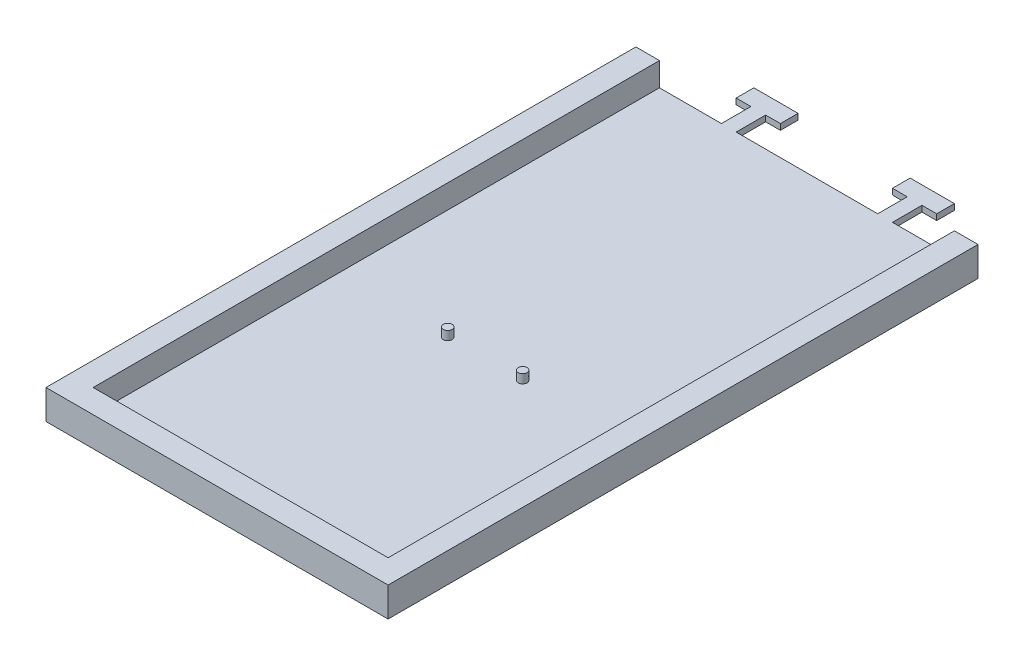
ISO-10303-21;
HEADER;
FILE_DESCRIPTION(('STEP AP214'),'2;1');
FILE_NAME('part.step','',(''),(''),'','','');
FILE_SCHEMA(('AUTOMOTIVE_DESIGN { 1 0 10303 214 1 1 1 1 }'));
ENDSEC;
DATA;
#1=APPLICATION_CONTEXT('core data for automotive mechanical design processes');
#2=APPLICATION_PROTOCOL_DEFINITION('international standard','automotive_design',2000,#1);
#3=PRODUCT_CONTEXT('',#1,'mechanical');
#4=PRODUCT('Part','Part','',(#3));
#5=PRODUCT_RELATED_PRODUCT_CATEGORY('part','',(#4));
#6=PRODUCT_DEFINITION_FORMATION('','',#4);
#7=PRODUCT_DEFINITION_CONTEXT('part definition',#1,'design');
#8=PRODUCT_DEFINITION('design','',#6,#7);
#9=PRODUCT_DEFINITION_SHAPE('','',#8);
#10=(LENGTH_UNIT() NAMED_UNIT(*) SI_UNIT(.MILLI.,.METRE.));
#11=(NAMED_UNIT(*) PLANE_ANGLE_UNIT() SI_UNIT($,.RADIAN.));
#12=(NAMED_UNIT(*) SI_UNIT($,.STERADIAN.) SOLID_ANGLE_UNIT());
#13=UNCERTAINTY_MEASURE_WITH_UNIT(LENGTH_MEASURE(1.E-05),#10,'distance_accuracy_value','');
#14=(GEOMETRIC_REPRESENTATION_CONTEXT(3) GLOBAL_UNCERTAINTY_ASSIGNED_CONTEXT((#13)) GLOBAL_UNIT_ASSIGNED_CONTEXT((#10,
#11,#12)) REPRESENTATION_CONTEXT('',''));
#15=CARTESIAN_POINT('',(0.,0.,0.));
#16=DIRECTION('',(0.,0.,1.));
#17=DIRECTION('',(1.,0.,0.));
#18=AXIS2_PLACEMENT_3D('',#15,#16,#17);
#19=CARTESIAN_POINT('',(-1156.10486715688,10.,-361.26737968449));
#20=DIRECTION('',(1.,0.,0.));
#21=DIRECTION('',(0.,0.,-1.));
#22=AXIS2_PLACEMENT_3D('',#19,#20,#21);
#23=PLANE('',#22);
#24=DIRECTION('',(0.,0.,1.));
#25=VECTOR('',#24,1.);
#26=CARTESIAN_POINT('',(-1156.10486715688,10.,-361.26737968449));
#27=LINE('',#26,#25);
#28=CARTESIAN_POINT('',(-1156.10486715688,10.,-561.26737968449));
#29=VERTEX_POINT('',#28);
#30=CARTESIAN_POINT('',(-1156.10486715688,10.,-361.26737968449));
#31=VERTEX_POINT('',#30);
#32=EDGE_CURVE('E100',#29,#31,#27,.T.);
#33=ORIENTED_EDGE('',*,*,#32,.F.);
#34=DIRECTION('',(0.,1.,0.));
#35=VECTOR('',#34,1.);
#36=CARTESIAN_POINT('',(-1156.10486715688,-8.,-561.26737968449));
#37=LINE('',#36,#35);
#38=CARTESIAN_POINT('',(-1156.10486715688,0.,-561.26737968449));
#39=VERTEX_POINT('',#38);
#40=EDGE_CURVE('E171',#39,#29,#37,.T.);
#41=ORIENTED_EDGE('',*,*,#40,.F.);
#42=DIRECTION('',(0.,0.,1.));
#43=VECTOR('',#42,1.);
#44=CARTESIAN_POINT('',(-1156.10486715688,0.,-361.26737968449));
#45=LINE('',#44,#43);
#46=CARTESIAN_POINT('',(-1156.10486715688,0.,-361.26737968449));
#47=VERTEX_POINT('',#46);
#48=EDGE_CURVE('E85',#39,#47,#45,.T.);
#49=ORIENTED_EDGE('',*,*,#48,.T.);
#50=DIRECTION('',(0.,-1.,0.));
#51=VECTOR('',#50,1.);
#52=CARTESIAN_POINT('',(-1156.10486715688,10.,-361.26737968449));
#53=LINE('',#52,#51);
#54=EDGE_CURVE('E80',#31,#47,#53,.T.);
#55=ORIENTED_EDGE('',*,*,#54,.F.);
#56=EDGE_LOOP('',(#33,#41,#49,#55));
#57=FACE_BOUND('',#56,.T.);
#58=ADVANCED_FACE('F38',(#57),#23,.F.);
#59=CARTESIAN_POINT('',(0.,0.,0.));
#60=DIRECTION('',(0.,-1.,0.));
#61=DIRECTION('',(0.,0.,-1.));
#62=AXIS2_PLACEMENT_3D('',#59,#60,#61);
#63=PLANE('',#62);
#64=DIRECTION('',(-1.,0.,0.));
#65=VECTOR('',#64,1.);
#66=CARTESIAN_POINT('',(0.,0.,-561.26737968449));
#67=LINE('',#66,#65);
#68=CARTESIAN_POINT('',(-1040.10486715688,0.,-561.26737968449));
#69=VERTEX_POINT('',#68);
#70=CARTESIAN_POINT('',(-1069.10486715688,0.,-561.26737968449));
#71=VERTEX_POINT('',#70);
#72=EDGE_CURVE('E98',#69,#71,#67,.T.);
#73=ORIENTED_EDGE('',*,*,#72,.F.);
#74=DIRECTION('',(0.,0.,-1.));
#75=VECTOR('',#74,1.);
#76=CARTESIAN_POINT('',(-1040.10486715688,0.,-777.26737968449));
#77=LINE('',#76,#75);
#78=CARTESIAN_POINT('',(-1040.10486715688,0.,-361.26737968449));
#79=VERTEX_POINT('',#78);
#80=EDGE_CURVE('E84',#79,#69,#77,.T.);
#81=ORIENTED_EDGE('',*,*,#80,.F.);
#82=DIRECTION('',(1.,0.,0.));
#83=VECTOR('',#82,1.);
#84=CARTESIAN_POINT('',(-1040.10486715688,0.,-361.26737968449));
#85=LINE('',#84,#83);
#86=EDGE_CURVE('E74',#47,#79,#85,.T.);
#87=ORIENTED_EDGE('',*,*,#86,.F.);
#88=ORIENTED_EDGE('',*,*,#48,.F.);
#89=DIRECTION('',(1.,0.,0.));
#90=VECTOR('',#89,1.);
#91=CARTESIAN_POINT('',(0.,0.,-561.26737968449));
#92=LINE('',#91,#90);
#93=CARTESIAN_POINT('',(-1127.10486715688,0.,-561.26737968449));
#94=VERTEX_POINT('',#93);
#95=EDGE_CURVE('E45',#39,#94,#92,.T.);
#96=ORIENTED_EDGE('',*,*,#95,.T.);
#97=DIRECTION('',(0.,0.,1.));
#98=VECTOR('',#97,1.);
#99=CARTESIAN_POINT('',(-1127.10486715688,0.,0.));
#100=LINE('',#99,#98);
#101=CARTESIAN_POINT('',(-1127.10486715688,0.,-571.26737968449));
#102=VERTEX_POINT('',#101);
#103=EDGE_CURVE('E141',#102,#94,#100,.T.);
#104=ORIENTED_EDGE('',*,*,#103,.F.);
#105=DIRECTION('',(1.,0.,0.));
#106=VECTOR('',#105,1.);
#107=CARTESIAN_POINT('',(0.,0.,-571.26737968449));
#108=LINE('',#107,#106);
#109=CARTESIAN_POINT('',(-1132.10486715688,0.,-571.26737968449));
#110=VERTEX_POINT('',#109);
#111=EDGE_CURVE('E138',#110,#102,#108,.T.);
#112=ORIENTED_EDGE('',*,*,#111,.F.);
#113=DIRECTION('',(0.,0.,1.));
#114=VECTOR('',#113,1.);
#115=CARTESIAN_POINT('',(-1132.10486715688,0.,0.));
#116=LINE('',#115,#114);
#117=CARTESIAN_POINT('',(-1132.10486715688,0.,-577.26737968449));
#118=VERTEX_POINT('',#117);
#119=EDGE_CURVE('E249',#118,#110,#116,.T.);
#120=ORIENTED_EDGE('',*,*,#119,.F.);
#121=DIRECTION('',(1.,0.,0.));
#122=VECTOR('',#121,1.);
#123=CARTESIAN_POINT('',(0.,0.,-577.26737968449));
#124=LINE('',#123,#122);
#125=CARTESIAN_POINT('',(-1117.10486715688,0.,-577.26737968449));
#126=VERTEX_POINT('',#125);
#127=EDGE_CURVE('E259',#118,#126,#124,.T.);
#128=ORIENTED_EDGE('',*,*,#127,.T.);
#129=DIRECTION('',(0.,0.,1.));
#130=VECTOR('',#129,1.);
#131=CARTESIAN_POINT('',(-1117.10486715688,0.,0.));
#132=LINE('',#131,#130);
#133=CARTESIAN_POINT('',(-1117.10486715688,0.,-571.26737968449));
#134=VERTEX_POINT('',#133);
#135=EDGE_CURVE('E246',#126,#134,#132,.T.);
#136=ORIENTED_EDGE('',*,*,#135,.T.);
#137=DIRECTION('',(-1.,0.,0.));
#138=VECTOR('',#137,1.);
#139=CARTESIAN_POINT('',(0.,0.,-571.26737968449));
#140=LINE('',#139,#138);
#141=CARTESIAN_POINT('',(-1122.10486715688,0.,-571.26737968449));
#142=VERTEX_POINT('',#141);
#143=EDGE_CURVE('E135',#134,#142,#140,.T.);
#144=ORIENTED_EDGE('',*,*,#143,.T.);
#145=DIRECTION('',(0.,0.,1.));
#146=VECTOR('',#145,1.);
#147=CARTESIAN_POINT('',(-1122.10486715688,0.,0.));
#148=LINE('',#147,#146);
#149=CARTESIAN_POINT('',(-1122.10486715688,0.,-561.26737968449));
#150=VERTEX_POINT('',#149);
#151=EDGE_CURVE('E132',#142,#150,#148,.T.);
#152=ORIENTED_EDGE('',*,*,#151,.T.);
#153=DIRECTION('',(-1.,0.,0.));
#154=VECTOR('',#153,1.);
#155=CARTESIAN_POINT('',(0.,0.,-561.26737968449));
#156=LINE('',#155,#154);
#157=CARTESIAN_POINT('',(-1074.10486715688,0.,-561.26737968449));
#158=VERTEX_POINT('',#157);
#159=EDGE_CURVE('E129',#158,#150,#156,.T.);
#160=ORIENTED_EDGE('',*,*,#159,.F.);
#161=DIRECTION('',(0.,0.,1.));
#162=VECTOR('',#161,1.);
#163=CARTESIAN_POINT('',(-1074.10486715688,0.,0.));
#164=LINE('',#163,#162);
#165=CARTESIAN_POINT('',(-1074.10486715688,0.,-571.26737968449));
#166=VERTEX_POINT('',#165);
#167=EDGE_CURVE('E123',#166,#158,#164,.T.);
#168=ORIENTED_EDGE('',*,*,#167,.F.);
#169=DIRECTION('',(1.,0.,0.));
#170=VECTOR('',#169,1.);
#171=CARTESIAN_POINT('',(0.,0.,-571.26737968449));
#172=LINE('',#171,#170);
#173=CARTESIAN_POINT('',(-1079.10486715688,0.,-571.26737968449));
#174=VERTEX_POINT('',#173);
#175=EDGE_CURVE('E126',#174,#166,#172,.T.);
#176=ORIENTED_EDGE('',*,*,#175,.F.);
#177=DIRECTION('',(0.,0.,1.));
#178=VECTOR('',#177,1.);
#179=CARTESIAN_POINT('',(-1079.10486715688,0.,0.));
#180=LINE('',#179,#178);
#181=CARTESIAN_POINT('',(-1079.10486715688,0.,-577.26737968449));
#182=VERTEX_POINT('',#181);
#183=EDGE_CURVE('E243',#182,#174,#180,.T.);
#184=ORIENTED_EDGE('',*,*,#183,.F.);
#185=CARTESIAN_POINT('',(-1064.10486715688,0.,-577.26737968449));
#186=VERTEX_POINT('',#185);
#187=EDGE_CURVE('E256',#182,#186,#124,.T.);
#188=ORIENTED_EDGE('',*,*,#187,.T.);
#189=DIRECTION('',(0.,0.,1.));
#190=VECTOR('',#189,1.);
#191=CARTESIAN_POINT('',(-1064.10486715688,0.,0.));
#192=LINE('',#191,#190);
#193=CARTESIAN_POINT('',(-1064.10486715688,0.,-571.26737968449));
#194=VERTEX_POINT('',#193);
#195=EDGE_CURVE('E173',#186,#194,#192,.T.);
#196=ORIENTED_EDGE('',*,*,#195,.T.);
#197=DIRECTION('',(-1.,0.,0.));
#198=VECTOR('',#197,1.);
#199=CARTESIAN_POINT('',(0.,0.,-571.26737968449));
#200=LINE('',#199,#198);
#201=CARTESIAN_POINT('',(-1069.10486715688,0.,-571.26737968449));
#202=VERTEX_POINT('',#201);
#203=EDGE_CURVE('E120',#194,#202,#200,.T.);
#204=ORIENTED_EDGE('',*,*,#203,.T.);
#205=DIRECTION('',(0.,0.,1.));
#206=VECTOR('',#205,1.);
#207=CARTESIAN_POINT('',(-1069.10486715688,0.,0.));
#208=LINE('',#207,#206);
#209=EDGE_CURVE('E118',#202,#71,#208,.T.);
#210=ORIENTED_EDGE('',*,*,#209,.T.);
#211=EDGE_LOOP('',(#73,#81,#87,#88,#96,#104,#112,#120,#128,#136,#144,#152,#160,#168,#176,#184,
#188,#196,#204,#210));
#212=FACE_BOUND('',#211,.T.);
#213=ADVANCED_FACE('F95',(#212),#63,.T.);
#214=CARTESIAN_POINT('',(-1040.10486715688,10.,-777.26737968449));
#215=DIRECTION('',(-1.,0.,0.));
#216=DIRECTION('',(0.,0.,1.));
#217=AXIS2_PLACEMENT_3D('',#214,#215,#216);
#218=PLANE('',#217);
#219=DIRECTION('',(0.,1.,0.));
#220=VECTOR('',#219,1.);
#221=CARTESIAN_POINT('',(-1040.10486715688,0.,-561.26737968449));
#222=LINE('',#221,#220);
#223=CARTESIAN_POINT('',(-1040.10486715688,10.,-561.26737968449));
#224=VERTEX_POINT('',#223);
#225=EDGE_CURVE('E311',#69,#224,#222,.T.);
#226=ORIENTED_EDGE('',*,*,#225,.T.);
#227=DIRECTION('',(0.,0.,-1.));
#228=VECTOR('',#227,1.);
#229=CARTESIAN_POINT('',(-1040.10486715688,10.,-777.26737968449));
#230=LINE('',#229,#228);
#231=CARTESIAN_POINT('',(-1040.10486715688,10.,-361.26737968449));
#232=VERTEX_POINT('',#231);
#233=EDGE_CURVE('E92',#232,#224,#230,.T.);
#234=ORIENTED_EDGE('',*,*,#233,.F.);
#235=DIRECTION('',(0.,-1.,0.));
#236=VECTOR('',#235,1.);
#237=CARTESIAN_POINT('',(-1040.10486715688,10.,-361.26737968449));
#238=LINE('',#237,#236);
#239=EDGE_CURVE('E77',#232,#79,#238,.T.);
#240=ORIENTED_EDGE('',*,*,#239,.T.);
#241=ORIENTED_EDGE('',*,*,#80,.T.);
#242=EDGE_LOOP('',(#226,#234,#240,#241));
#243=FACE_BOUND('',#242,.T.);
#244=ADVANCED_FACE('F90',(#243),#218,.F.);
#245=CARTESIAN_POINT('',(0.,10.,0.));
#246=DIRECTION('',(0.,-1.,0.));
#247=DIRECTION('',(0.,0.,-1.));
#248=AXIS2_PLACEMENT_3D('',#245,#246,#247);
#249=PLANE('',#248);
#250=DIRECTION('',(-1.,0.,0.));
#251=VECTOR('',#250,1.);
#252=CARTESIAN_POINT('',(-1148.10486715688,10.,-561.26737968449));
#253=LINE('',#252,#251);
#254=CARTESIAN_POINT('',(-1148.10486715688,10.,-561.26737968449));
#255=VERTEX_POINT('',#254);
#256=EDGE_CURVE('E300',#255,#29,#253,.T.);
#257=ORIENTED_EDGE('',*,*,#256,.T.);
#258=ORIENTED_EDGE('',*,*,#32,.T.);
#259=DIRECTION('',(1.,0.,0.));
#260=VECTOR('',#259,1.);
#261=CARTESIAN_POINT('',(-1040.10486715688,10.,-361.26737968449));
#262=LINE('',#261,#260);
#263=EDGE_CURVE('E61',#31,#232,#262,.T.);
#264=ORIENTED_EDGE('',*,*,#263,.T.);
#265=ORIENTED_EDGE('',*,*,#233,.T.);
#266=DIRECTION('',(-1.,0.,0.));
#267=VECTOR('',#266,1.);
#268=CARTESIAN_POINT('',(-1040.10486715688,10.,-561.26737968449));
#269=LINE('',#268,#267);
#270=CARTESIAN_POINT('',(-1048.10486715688,10.,-561.26737968449));
#271=VERTEX_POINT('',#270);
#272=EDGE_CURVE('E307',#224,#271,#269,.T.);
#273=ORIENTED_EDGE('',*,*,#272,.T.);
#274=DIRECTION('',(0.,0.,-1.));
#275=VECTOR('',#274,1.);
#276=CARTESIAN_POINT('',(-1048.10486715688,10.,-769.26737968449));
#277=LINE('',#276,#275);
#278=CARTESIAN_POINT('',(-1048.10486715688,10.,-369.26737968449));
#279=VERTEX_POINT('',#278);
#280=EDGE_CURVE('E263',#279,#271,#277,.T.);
#281=ORIENTED_EDGE('',*,*,#280,.F.);
#282=DIRECTION('',(1.,0.,0.));
#283=VECTOR('',#282,1.);
#284=CARTESIAN_POINT('',(-1148.10486715688,10.,-369.26737968449));
#285=LINE('',#284,#283);
#286=CARTESIAN_POINT('',(-1148.10486715688,10.,-369.26737968449));
#287=VERTEX_POINT('',#286);
#288=EDGE_CURVE('E271',#287,#279,#285,.T.);
#289=ORIENTED_EDGE('',*,*,#288,.F.);
#290=DIRECTION('',(0.,0.,1.));
#291=VECTOR('',#290,1.);
#292=CARTESIAN_POINT('',(-1148.10486715688,10.,-769.26737968449));
#293=LINE('',#292,#291);
#294=EDGE_CURVE('E280',#255,#287,#293,.T.);
#295=ORIENTED_EDGE('',*,*,#294,.F.);
#296=EDGE_LOOP('',(#257,#258,#264,#265,#273,#281,#289,#295));
#297=FACE_BOUND('',#296,.T.);
#298=ADVANCED_FACE('F305',(#297),#249,.F.);
#299=CARTESIAN_POINT('',(-1048.10486715688,2.,-769.26737968449));
#300=DIRECTION('',(1.,0.,0.));
#301=DIRECTION('',(0.,0.,-1.));
#302=AXIS2_PLACEMENT_3D('',#299,#300,#301);
#303=PLANE('',#302);
#304=DIRECTION('',(0.,1.,0.));
#305=VECTOR('',#304,1.);
#306=CARTESIAN_POINT('',(-1048.10486715688,0.,-561.26737968449));
#307=LINE('',#306,#305);
#308=CARTESIAN_POINT('',(-1048.10486715688,2.,-561.26737968449));
#309=VERTEX_POINT('',#308);
#310=EDGE_CURVE('E316',#309,#271,#307,.T.);
#311=ORIENTED_EDGE('',*,*,#310,.F.);
#312=DIRECTION('',(0.,0.,-1.));
#313=VECTOR('',#312,1.);
#314=CARTESIAN_POINT('',(-1048.10486715688,2.,-769.26737968449));
#315=LINE('',#314,#313);
#316=CARTESIAN_POINT('',(-1048.10486715688,2.,-369.26737968449));
#317=VERTEX_POINT('',#316);
#318=EDGE_CURVE('E267',#317,#309,#315,.T.);
#319=ORIENTED_EDGE('',*,*,#318,.F.);
#320=DIRECTION('',(0.,1.,0.));
#321=VECTOR('',#320,1.);
#322=CARTESIAN_POINT('',(-1048.10486715688,2.,-369.26737968449));
#323=LINE('',#322,#321);
#324=EDGE_CURVE('E285',#317,#279,#323,.T.);
#325=ORIENTED_EDGE('',*,*,#324,.T.);
#326=ORIENTED_EDGE('',*,*,#280,.T.);
#327=EDGE_LOOP('',(#311,#319,#325,#326));
#328=FACE_BOUND('',#327,.T.);
#329=ADVANCED_FACE('F411',(#328),#303,.F.);
#330=CARTESIAN_POINT('',(-1148.10486715688,2.,-769.26737968449));
#331=DIRECTION('',(-1.,0.,0.));
#332=DIRECTION('',(0.,0.,1.));
#333=AXIS2_PLACEMENT_3D('',#330,#331,#332);
#334=PLANE('',#333);
#335=DIRECTION('',(0.,1.,0.));
#336=VECTOR('',#335,1.);
#337=CARTESIAN_POINT('',(-1148.10486715688,0.,-561.26737968449));
#338=LINE('',#337,#336);
#339=CARTESIAN_POINT('',(-1148.10486715688,2.,-561.26737968449));
#340=VERTEX_POINT('',#339);
#341=EDGE_CURVE('E224',#340,#255,#338,.T.);
#342=ORIENTED_EDGE('',*,*,#341,.T.);
#343=ORIENTED_EDGE('',*,*,#294,.T.);
#344=DIRECTION('',(0.,1.,0.));
#345=VECTOR('',#344,1.);
#346=CARTESIAN_POINT('',(-1148.10486715688,2.,-369.26737968449));
#347=LINE('',#346,#345);
#348=CARTESIAN_POINT('',(-1148.10486715688,2.,-369.26737968449));
#349=VERTEX_POINT('',#348);
#350=EDGE_CURVE('E277',#349,#287,#347,.T.);
#351=ORIENTED_EDGE('',*,*,#350,.F.);
#352=DIRECTION('',(0.,0.,1.));
#353=VECTOR('',#352,1.);
#354=CARTESIAN_POINT('',(-1148.10486715688,2.,-769.26737968449));
#355=LINE('',#354,#353);
#356=EDGE_CURVE('E270',#340,#349,#355,.T.);
#357=ORIENTED_EDGE('',*,*,#356,.F.);
#358=EDGE_LOOP('',(#342,#343,#351,#357));
#359=FACE_BOUND('',#358,.T.);
#360=ADVANCED_FACE('F429',(#359),#334,.F.);
#361=CARTESIAN_POINT('',(0.,2.,0.));
#362=DIRECTION('',(0.,1.,0.));
#363=DIRECTION('',(0.,0.,1.));
#364=AXIS2_PLACEMENT_3D('',#361,#362,#363);
#365=PLANE('',#364);
#366=CARTESIAN_POINT('',(-1110.80486715688,2.,-452.168271651608));
#367=DIRECTION('',(0.,1.,0.));
#368=DIRECTION('',(0.,0.,1.));
#369=AXIS2_PLACEMENT_3D('',#366,#367,#368);
#370=CIRCLE('',#369,1.50000000000008);
#371=CARTESIAN_POINT('',(-1110.80486715688,2.,-450.668271651608));
#372=VERTEX_POINT('',#371);
#373=EDGE_CURVE('E11',#372,#372,#370,.T.);
#374=ORIENTED_EDGE('',*,*,#373,.F.);
#375=EDGE_LOOP('',(#374));
#376=FACE_BOUND('',#375,.T.);
#377=CARTESIAN_POINT('',(-1085.40486715688,2.,-452.168271651608));
#378=DIRECTION('',(0.,1.,0.));
#379=DIRECTION('',(0.,0.,1.));
#380=AXIS2_PLACEMENT_3D('',#377,#378,#379);
#381=CIRCLE('',#380,1.50000000000008);
#382=CARTESIAN_POINT('',(-1085.40486715688,2.,-450.668271651608));
#383=VERTEX_POINT('',#382);
#384=EDGE_CURVE('E264',#383,#383,#381,.T.);
#385=ORIENTED_EDGE('',*,*,#384,.F.);
#386=EDGE_LOOP('',(#385));
#387=FACE_BOUND('',#386,.T.);
#388=DIRECTION('',(0.,0.,-1.));
#389=VECTOR('',#388,1.);
#390=CARTESIAN_POINT('',(-1127.10486715688,2.,0.));
#391=LINE('',#390,#389);
#392=CARTESIAN_POINT('',(-1127.10486715688,2.,-561.26737968449));
#393=VERTEX_POINT('',#392);
#394=CARTESIAN_POINT('',(-1127.10486715688,2.,-571.26737968449));
#395=VERTEX_POINT('',#394);
#396=EDGE_CURVE('E181',#393,#395,#391,.T.);
#397=ORIENTED_EDGE('',*,*,#396,.F.);
#398=DIRECTION('',(-1.,0.,0.));
#399=VECTOR('',#398,1.);
#400=CARTESIAN_POINT('',(0.,2.,-561.26737968449));
#401=LINE('',#400,#399);
#402=EDGE_CURVE('E169',#393,#340,#401,.T.);
#403=ORIENTED_EDGE('',*,*,#402,.T.);
#404=ORIENTED_EDGE('',*,*,#356,.T.);
#405=DIRECTION('',(1.,0.,0.));
#406=VECTOR('',#405,1.);
#407=CARTESIAN_POINT('',(-1148.10486715688,2.,-369.26737968449));
#408=LINE('',#407,#406);
#409=EDGE_CURVE('E274',#349,#317,#408,.T.);
#410=ORIENTED_EDGE('',*,*,#409,.T.);
#411=ORIENTED_EDGE('',*,*,#318,.T.);
#412=DIRECTION('',(1.,0.,0.));
#413=VECTOR('',#412,1.);
#414=CARTESIAN_POINT('',(0.,2.,-561.26737968449));
#415=LINE('',#414,#413);
#416=CARTESIAN_POINT('',(-1069.10486715688,2.,-561.26737968449));
#417=VERTEX_POINT('',#416);
#418=EDGE_CURVE('E223',#417,#309,#415,.T.);
#419=ORIENTED_EDGE('',*,*,#418,.F.);
#420=DIRECTION('',(0.,0.,-1.));
#421=VECTOR('',#420,1.);
#422=CARTESIAN_POINT('',(-1069.10486715688,2.,0.));
#423=LINE('',#422,#421);
#424=CARTESIAN_POINT('',(-1069.10486715688,2.,-571.26737968449));
#425=VERTEX_POINT('',#424);
#426=EDGE_CURVE('E220',#417,#425,#423,.T.);
#427=ORIENTED_EDGE('',*,*,#426,.T.);
#428=DIRECTION('',(1.,0.,0.));
#429=VECTOR('',#428,1.);
#430=CARTESIAN_POINT('',(0.,2.,-571.26737968449));
#431=LINE('',#430,#429);
#432=CARTESIAN_POINT('',(-1064.10486715688,2.,-571.26737968449));
#433=VERTEX_POINT('',#432);
#434=EDGE_CURVE('E230',#425,#433,#431,.T.);
#435=ORIENTED_EDGE('',*,*,#434,.T.);
#436=DIRECTION('',(0.,0.,-1.));
#437=VECTOR('',#436,1.);
#438=CARTESIAN_POINT('',(-1064.10486715688,2.,0.));
#439=LINE('',#438,#437);
#440=CARTESIAN_POINT('',(-1064.10486715688,2.,-577.26737968449));
#441=VERTEX_POINT('',#440);
#442=EDGE_CURVE('E227',#433,#441,#439,.T.);
#443=ORIENTED_EDGE('',*,*,#442,.T.);
#444=DIRECTION('',(-1.,0.,0.));
#445=VECTOR('',#444,1.);
#446=CARTESIAN_POINT('',(0.,2.,-577.26737968449));
#447=LINE('',#446,#445);
#448=CARTESIAN_POINT('',(-1079.10486715688,2.,-577.26737968449));
#449=VERTEX_POINT('',#448);
#450=EDGE_CURVE('E255',#441,#449,#447,.T.);
#451=ORIENTED_EDGE('',*,*,#450,.T.);
#452=DIRECTION('',(0.,0.,-1.));
#453=VECTOR('',#452,1.);
#454=CARTESIAN_POINT('',(-1079.10486715688,2.,0.));
#455=LINE('',#454,#453);
#456=CARTESIAN_POINT('',(-1079.10486715688,2.,-571.26737968449));
#457=VERTEX_POINT('',#456);
#458=EDGE_CURVE('E52',#457,#449,#455,.T.);
#459=ORIENTED_EDGE('',*,*,#458,.F.);
#460=DIRECTION('',(-1.,0.,0.));
#461=VECTOR('',#460,1.);
#462=CARTESIAN_POINT('',(0.,2.,-571.26737968449));
#463=LINE('',#462,#461);
#464=CARTESIAN_POINT('',(-1074.10486715688,2.,-571.26737968449));
#465=VERTEX_POINT('',#464);
#466=EDGE_CURVE('E189',#465,#457,#463,.T.);
#467=ORIENTED_EDGE('',*,*,#466,.F.);
#468=DIRECTION('',(0.,0.,-1.));
#469=VECTOR('',#468,1.);
#470=CARTESIAN_POINT('',(-1074.10486715688,2.,0.));
#471=LINE('',#470,#469);
#472=CARTESIAN_POINT('',(-1074.10486715688,2.,-561.26737968449));
#473=VERTEX_POINT('',#472);
#474=EDGE_CURVE('E185',#473,#465,#471,.T.);
#475=ORIENTED_EDGE('',*,*,#474,.F.);
#476=DIRECTION('',(1.,0.,0.));
#477=VECTOR('',#476,1.);
#478=CARTESIAN_POINT('',(0.,2.,-561.26737968449));
#479=LINE('',#478,#477);
#480=CARTESIAN_POINT('',(-1122.10486715688,2.,-561.26737968449));
#481=VERTEX_POINT('',#480);
#482=EDGE_CURVE('E182',#481,#473,#479,.T.);
#483=ORIENTED_EDGE('',*,*,#482,.F.);
#484=DIRECTION('',(0.,0.,-1.));
#485=VECTOR('',#484,1.);
#486=CARTESIAN_POINT('',(-1122.10486715688,2.,0.));
#487=LINE('',#486,#485);
#488=CARTESIAN_POINT('',(-1122.10486715688,2.,-571.26737968449));
#489=VERTEX_POINT('',#488);
#490=EDGE_CURVE('E199',#481,#489,#487,.T.);
#491=ORIENTED_EDGE('',*,*,#490,.T.);
#492=DIRECTION('',(1.,0.,0.));
#493=VECTOR('',#492,1.);
#494=CARTESIAN_POINT('',(0.,2.,-571.26737968449));
#495=LINE('',#494,#493);
#496=CARTESIAN_POINT('',(-1117.10486715688,2.,-571.26737968449));
#497=VERTEX_POINT('',#496);
#498=EDGE_CURVE('E196',#489,#497,#495,.T.);
#499=ORIENTED_EDGE('',*,*,#498,.T.);
#500=DIRECTION('',(0.,0.,-1.));
#501=VECTOR('',#500,1.);
#502=CARTESIAN_POINT('',(-1117.10486715688,2.,0.));
#503=LINE('',#502,#501);
#504=CARTESIAN_POINT('',(-1117.10486715688,2.,-577.26737968449));
#505=VERTEX_POINT('',#504);
#506=EDGE_CURVE('E193',#497,#505,#503,.T.);
#507=ORIENTED_EDGE('',*,*,#506,.T.);
#508=CARTESIAN_POINT('',(-1132.10486715688,2.,-577.26737968449));
#509=VERTEX_POINT('',#508);
#510=EDGE_CURVE('E252',#505,#509,#447,.T.);
#511=ORIENTED_EDGE('',*,*,#510,.T.);
#512=DIRECTION('',(0.,0.,-1.));
#513=VECTOR('',#512,1.);
#514=CARTESIAN_POINT('',(-1132.10486715688,2.,0.));
#515=LINE('',#514,#513);
#516=CARTESIAN_POINT('',(-1132.10486715688,2.,-571.26737968449));
#517=VERTEX_POINT('',#516);
#518=EDGE_CURVE('E322',#517,#509,#515,.T.);
#519=ORIENTED_EDGE('',*,*,#518,.F.);
#520=DIRECTION('',(-1.,0.,0.));
#521=VECTOR('',#520,1.);
#522=CARTESIAN_POINT('',(0.,2.,-571.26737968449));
#523=LINE('',#522,#521);
#524=EDGE_CURVE('E206',#395,#517,#523,.T.);
#525=ORIENTED_EDGE('',*,*,#524,.F.);
#526=EDGE_LOOP('',(#397,#403,#404,#410,#411,#419,#427,#435,#443,#451,#459,#467,#475,#483,#491,
#499,#507,#511,#519,#525));
#527=FACE_BOUND('',#526,.T.);
#528=ADVANCED_FACE('F331',(#376,#387,#527),#365,.T.);
#529=CARTESIAN_POINT('',(-1040.10486715688,12.,-577.26737968449));
#530=DIRECTION('',(0.,0.,-1.));
#531=DIRECTION('',(-1.,0.,0.));
#532=AXIS2_PLACEMENT_3D('',#529,#530,#531);
#533=PLANE('',#532);
#534=DIRECTION('',(0.,-1.,0.));
#535=VECTOR('',#534,1.);
#536=CARTESIAN_POINT('',(-1132.10486715688,12.,-577.26737968449));
#537=LINE('',#536,#535);
#538=EDGE_CURVE('E114',#509,#118,#537,.T.);
#539=ORIENTED_EDGE('',*,*,#538,.F.);
#540=ORIENTED_EDGE('',*,*,#510,.F.);
#541=DIRECTION('',(0.,-1.,0.));
#542=VECTOR('',#541,1.);
#543=CARTESIAN_POINT('',(-1117.10486715688,12.,-577.26737968449));
#544=LINE('',#543,#542);
#545=EDGE_CURVE('E111',#505,#126,#544,.T.);
#546=ORIENTED_EDGE('',*,*,#545,.T.);
#547=ORIENTED_EDGE('',*,*,#127,.F.);
#548=EDGE_LOOP('',(#539,#540,#546,#547));
#549=FACE_BOUND('',#548,.T.);
#550=ADVANCED_FACE('F436',(#549),#533,.T.);
#551=DIRECTION('',(0.,-1.,0.));
#552=VECTOR('',#551,1.);
#553=CARTESIAN_POINT('',(-1079.10486715688,12.,-577.26737968449));
#554=LINE('',#553,#552);
#555=EDGE_CURVE('E109',#449,#182,#554,.T.);
#556=ORIENTED_EDGE('',*,*,#555,.F.);
#557=ORIENTED_EDGE('',*,*,#450,.F.);
#558=DIRECTION('',(0.,-1.,0.));
#559=VECTOR('',#558,1.);
#560=CARTESIAN_POINT('',(-1064.10486715688,12.,-577.26737968449));
#561=LINE('',#560,#559);
#562=EDGE_CURVE('E106',#441,#186,#561,.T.);
#563=ORIENTED_EDGE('',*,*,#562,.T.);
#564=ORIENTED_EDGE('',*,*,#187,.F.);
#565=EDGE_LOOP('',(#556,#557,#563,#564));
#566=FACE_BOUND('',#565,.T.);
#567=ADVANCED_FACE('F452',(#566),#533,.T.);
#568=CARTESIAN_POINT('',(-1040.10486715688,10.,-361.26737968449));
#569=DIRECTION('',(0.,0.,-1.));
#570=DIRECTION('',(-1.,0.,0.));
#571=AXIS2_PLACEMENT_3D('',#568,#569,#570);
#572=PLANE('',#571);
#573=ORIENTED_EDGE('',*,*,#86,.T.);
#574=ORIENTED_EDGE('',*,*,#239,.F.);
#575=ORIENTED_EDGE('',*,*,#263,.F.);
#576=ORIENTED_EDGE('',*,*,#54,.T.);
#577=EDGE_LOOP('',(#573,#574,#575,#576));
#578=FACE_BOUND('',#577,.T.);
#579=ADVANCED_FACE('F76',(#578),#572,.F.);
#580=CARTESIAN_POINT('',(-1148.10486715688,2.,-369.26737968449));
#581=DIRECTION('',(0.,0.,1.));
#582=DIRECTION('',(1.,0.,0.));
#583=AXIS2_PLACEMENT_3D('',#580,#581,#582);
#584=PLANE('',#583);
#585=ORIENTED_EDGE('',*,*,#288,.T.);
#586=ORIENTED_EDGE('',*,*,#324,.F.);
#587=ORIENTED_EDGE('',*,*,#409,.F.);
#588=ORIENTED_EDGE('',*,*,#350,.T.);
#589=EDGE_LOOP('',(#585,#586,#587,#588));
#590=FACE_BOUND('',#589,.T.);
#591=ADVANCED_FACE('F415',(#590),#584,.F.);
#592=CARTESIAN_POINT('',(-1085.40486715688,5.,-452.168271651608));
#593=DIRECTION('',(0.,-1.,0.));
#594=DIRECTION('',(0.,0.,-1.));
#595=AXIS2_PLACEMENT_3D('',#592,#593,#594);
#596=CYLINDRICAL_SURFACE('',#595,1.50000000000008);
#597=CARTESIAN_POINT('',(-1085.40486715688,5.,-452.168271651608));
#598=DIRECTION('',(0.,1.,0.));
#599=DIRECTION('',(0.,0.,1.));
#600=AXIS2_PLACEMENT_3D('',#597,#598,#599);
#601=CIRCLE('',#600,1.50000000000008);
#602=CARTESIAN_POINT('',(-1085.40486715688,5.,-450.668271651608));
#603=VERTEX_POINT('',#602);
#604=EDGE_CURVE('E260',#603,#603,#601,.T.);
#605=ORIENTED_EDGE('',*,*,#604,.F.);
#606=EDGE_LOOP('',(#605));
#607=FACE_BOUND('',#606,.T.);
#608=ORIENTED_EDGE('',*,*,#384,.T.);
#609=EDGE_LOOP('',(#608));
#610=FACE_BOUND('',#609,.T.);
#611=ADVANCED_FACE('F457',(#607,#610),#596,.T.);
#612=CARTESIAN_POINT('',(0.,5.,0.));
#613=DIRECTION('',(0.,1.,0.));
#614=DIRECTION('',(0.,0.,1.));
#615=AXIS2_PLACEMENT_3D('',#612,#613,#614);
#616=PLANE('',#615);
#617=ORIENTED_EDGE('',*,*,#604,.T.);
#618=EDGE_LOOP('',(#617));
#619=FACE_BOUND('',#618,.T.);
#620=ADVANCED_FACE('F468',(#619),#616,.T.);
#621=CARTESIAN_POINT('',(-1069.10486715688,-8.,0.));
#622=DIRECTION('',(1.,0.,0.));
#623=DIRECTION('',(0.,0.,-1.));
#624=AXIS2_PLACEMENT_3D('',#621,#622,#623);
#625=PLANE('',#624);
#626=DIRECTION('',(0.,1.,0.));
#627=VECTOR('',#626,1.);
#628=CARTESIAN_POINT('',(-1069.10486715688,-8.,-571.26737968449));
#629=LINE('',#628,#627);
#630=EDGE_CURVE('E186',#202,#425,#629,.T.);
#631=ORIENTED_EDGE('',*,*,#630,.T.);
#632=ORIENTED_EDGE('',*,*,#426,.F.);
#633=DIRECTION('',(0.,1.,0.));
#634=VECTOR('',#633,1.);
#635=CARTESIAN_POINT('',(-1069.10486715688,-8.,-561.26737968449));
#636=LINE('',#635,#634);
#637=EDGE_CURVE('E233',#71,#417,#636,.T.);
#638=ORIENTED_EDGE('',*,*,#637,.F.);
#639=ORIENTED_EDGE('',*,*,#209,.F.);
#640=EDGE_LOOP('',(#631,#632,#638,#639));
#641=FACE_BOUND('',#640,.T.);
#642=ADVANCED_FACE('F466',(#641),#625,.T.);
#643=CARTESIAN_POINT('',(0.,-8.,-571.26737968449));
#644=DIRECTION('',(0.,0.,1.));
#645=DIRECTION('',(1.,0.,0.));
#646=AXIS2_PLACEMENT_3D('',#643,#644,#645);
#647=PLANE('',#646);
#648=DIRECTION('',(0.,1.,0.));
#649=VECTOR('',#648,1.);
#650=CARTESIAN_POINT('',(-1064.10486715688,-8.,-571.26737968449));
#651=LINE('',#650,#649);
#652=EDGE_CURVE('E236',#194,#433,#651,.T.);
#653=ORIENTED_EDGE('',*,*,#652,.T.);
#654=ORIENTED_EDGE('',*,*,#434,.F.);
#655=ORIENTED_EDGE('',*,*,#630,.F.);
#656=ORIENTED_EDGE('',*,*,#203,.F.);
#657=EDGE_LOOP('',(#653,#654,#655,#656));
#658=FACE_BOUND('',#657,.T.);
#659=ADVANCED_FACE('F493',(#658),#647,.T.);
#660=CARTESIAN_POINT('',(-1064.10486715688,-8.,0.));
#661=DIRECTION('',(1.,0.,0.));
#662=DIRECTION('',(0.,0.,-1.));
#663=AXIS2_PLACEMENT_3D('',#660,#661,#662);
#664=PLANE('',#663);
#665=ORIENTED_EDGE('',*,*,#562,.F.);
#666=ORIENTED_EDGE('',*,*,#442,.F.);
#667=ORIENTED_EDGE('',*,*,#652,.F.);
#668=ORIENTED_EDGE('',*,*,#195,.F.);
#669=EDGE_LOOP('',(#665,#666,#667,#668));
#670=FACE_BOUND('',#669,.T.);
#671=ADVANCED_FACE('F500',(#670),#664,.T.);
#672=CARTESIAN_POINT('',(0.,-8.,-561.26737968449));
#673=DIRECTION('',(0.,0.,1.));
#674=DIRECTION('',(1.,0.,0.));
#675=AXIS2_PLACEMENT_3D('',#672,#673,#674);
#676=PLANE('',#675);
#677=ORIENTED_EDGE('',*,*,#72,.T.);
#678=ORIENTED_EDGE('',*,*,#637,.T.);
#679=ORIENTED_EDGE('',*,*,#418,.T.);
#680=ORIENTED_EDGE('',*,*,#310,.T.);
#681=ORIENTED_EDGE('',*,*,#272,.F.);
#682=ORIENTED_EDGE('',*,*,#225,.F.);
#683=EDGE_LOOP('',(#677,#678,#679,#680,#681,#682));
#684=FACE_BOUND('',#683,.T.);
#685=ADVANCED_FACE('F421',(#684),#676,.F.);
#686=CARTESIAN_POINT('',(0.,-8.,-561.26737968449));
#687=DIRECTION('',(0.,0.,1.));
#688=DIRECTION('',(1.,0.,0.));
#689=AXIS2_PLACEMENT_3D('',#686,#687,#688);
#690=PLANE('',#689);
#691=ORIENTED_EDGE('',*,*,#159,.T.);
#692=DIRECTION('',(0.,1.,0.));
#693=VECTOR('',#692,1.);
#694=CARTESIAN_POINT('',(-1122.10486715688,-8.,-561.26737968449));
#695=LINE('',#694,#693);
#696=EDGE_CURVE('E203',#150,#481,#695,.T.);
#697=ORIENTED_EDGE('',*,*,#696,.T.);
#698=ORIENTED_EDGE('',*,*,#482,.T.);
#699=DIRECTION('',(0.,1.,0.));
#700=VECTOR('',#699,1.);
#701=CARTESIAN_POINT('',(-1074.10486715688,-8.,-561.26737968449));
#702=LINE('',#701,#700);
#703=EDGE_CURVE('E202',#158,#473,#702,.T.);
#704=ORIENTED_EDGE('',*,*,#703,.F.);
#705=EDGE_LOOP('',(#691,#697,#698,#704));
#706=FACE_BOUND('',#705,.T.);
#707=ADVANCED_FACE('F516',(#706),#690,.F.);
#708=CARTESIAN_POINT('',(-1122.10486715688,-8.,0.));
#709=DIRECTION('',(1.,0.,0.));
#710=DIRECTION('',(0.,0.,-1.));
#711=AXIS2_PLACEMENT_3D('',#708,#709,#710);
#712=PLANE('',#711);
#713=DIRECTION('',(0.,1.,0.));
#714=VECTOR('',#713,1.);
#715=CARTESIAN_POINT('',(-1122.10486715688,-8.,-571.26737968449));
#716=LINE('',#715,#714);
#717=EDGE_CURVE('E207',#142,#489,#716,.T.);
#718=ORIENTED_EDGE('',*,*,#717,.T.);
#719=ORIENTED_EDGE('',*,*,#490,.F.);
#720=ORIENTED_EDGE('',*,*,#696,.F.);
#721=ORIENTED_EDGE('',*,*,#151,.F.);
#722=EDGE_LOOP('',(#718,#719,#720,#721));
#723=FACE_BOUND('',#722,.T.);
#724=ADVANCED_FACE('F522',(#723),#712,.T.);
#725=CARTESIAN_POINT('',(0.,-8.,-571.26737968449));
#726=DIRECTION('',(0.,0.,1.));
#727=DIRECTION('',(1.,0.,0.));
#728=AXIS2_PLACEMENT_3D('',#725,#726,#727);
#729=PLANE('',#728);
#730=DIRECTION('',(0.,1.,0.));
#731=VECTOR('',#730,1.);
#732=CARTESIAN_POINT('',(-1117.10486715688,-8.,-571.26737968449));
#733=LINE('',#732,#731);
#734=EDGE_CURVE('E210',#134,#497,#733,.T.);
#735=ORIENTED_EDGE('',*,*,#734,.T.);
#736=ORIENTED_EDGE('',*,*,#498,.F.);
#737=ORIENTED_EDGE('',*,*,#717,.F.);
#738=ORIENTED_EDGE('',*,*,#143,.F.);
#739=EDGE_LOOP('',(#735,#736,#737,#738));
#740=FACE_BOUND('',#739,.T.);
#741=ADVANCED_FACE('F530',(#740),#729,.T.);
#742=CARTESIAN_POINT('',(-1117.10486715688,-8.,0.));
#743=DIRECTION('',(1.,0.,0.));
#744=DIRECTION('',(0.,0.,-1.));
#745=AXIS2_PLACEMENT_3D('',#742,#743,#744);
#746=PLANE('',#745);
#747=ORIENTED_EDGE('',*,*,#545,.F.);
#748=ORIENTED_EDGE('',*,*,#506,.F.);
#749=ORIENTED_EDGE('',*,*,#734,.F.);
#750=ORIENTED_EDGE('',*,*,#135,.F.);
#751=EDGE_LOOP('',(#747,#748,#749,#750));
#752=FACE_BOUND('',#751,.T.);
#753=ADVANCED_FACE('F538',(#752),#746,.T.);
#754=CARTESIAN_POINT('',(-1079.10486715688,-8.,0.));
#755=DIRECTION('',(1.,0.,0.));
#756=DIRECTION('',(0.,0.,-1.));
#757=AXIS2_PLACEMENT_3D('',#754,#755,#756);
#758=PLANE('',#757);
#759=ORIENTED_EDGE('',*,*,#183,.T.);
#760=DIRECTION('',(0.,1.,0.));
#761=VECTOR('',#760,1.);
#762=CARTESIAN_POINT('',(-1079.10486715688,-8.,-571.26737968449));
#763=LINE('',#762,#761);
#764=EDGE_CURVE('E213',#174,#457,#763,.T.);
#765=ORIENTED_EDGE('',*,*,#764,.T.);
#766=ORIENTED_EDGE('',*,*,#458,.T.);
#767=ORIENTED_EDGE('',*,*,#555,.T.);
#768=EDGE_LOOP('',(#759,#765,#766,#767));
#769=FACE_BOUND('',#768,.T.);
#770=ADVANCED_FACE('F546',(#769),#758,.F.);
#771=CARTESIAN_POINT('',(0.,-8.,-571.26737968449));
#772=DIRECTION('',(0.,0.,-1.));
#773=DIRECTION('',(-1.,0.,0.));
#774=AXIS2_PLACEMENT_3D('',#771,#772,#773);
#775=PLANE('',#774);
#776=ORIENTED_EDGE('',*,*,#175,.T.);
#777=DIRECTION('',(0.,1.,0.));
#778=VECTOR('',#777,1.);
#779=CARTESIAN_POINT('',(-1074.10486715688,-8.,-571.26737968449));
#780=LINE('',#779,#778);
#781=EDGE_CURVE('E215',#166,#465,#780,.T.);
#782=ORIENTED_EDGE('',*,*,#781,.T.);
#783=ORIENTED_EDGE('',*,*,#466,.T.);
#784=ORIENTED_EDGE('',*,*,#764,.F.);
#785=EDGE_LOOP('',(#776,#782,#783,#784));
#786=FACE_BOUND('',#785,.T.);
#787=ADVANCED_FACE('F554',(#786),#775,.F.);
#788=CARTESIAN_POINT('',(-1074.10486715688,-8.,0.));
#789=DIRECTION('',(1.,0.,0.));
#790=DIRECTION('',(0.,0.,-1.));
#791=AXIS2_PLACEMENT_3D('',#788,#789,#790);
#792=PLANE('',#791);
#793=ORIENTED_EDGE('',*,*,#167,.T.);
#794=ORIENTED_EDGE('',*,*,#703,.T.);
#795=ORIENTED_EDGE('',*,*,#474,.T.);
#796=ORIENTED_EDGE('',*,*,#781,.F.);
#797=EDGE_LOOP('',(#793,#794,#795,#796));
#798=FACE_BOUND('',#797,.T.);
#799=ADVANCED_FACE('F561',(#798),#792,.F.);
#800=CARTESIAN_POINT('',(0.,-8.,-571.26737968449));
#801=DIRECTION('',(0.,0.,-1.));
#802=DIRECTION('',(-1.,0.,0.));
#803=AXIS2_PLACEMENT_3D('',#800,#801,#802);
#804=PLANE('',#803);
#805=ORIENTED_EDGE('',*,*,#111,.T.);
#806=DIRECTION('',(0.,1.,0.));
#807=VECTOR('',#806,1.);
#808=CARTESIAN_POINT('',(-1127.10486715688,-8.,-571.26737968449));
#809=LINE('',#808,#807);
#810=EDGE_CURVE('E165',#102,#395,#809,.T.);
#811=ORIENTED_EDGE('',*,*,#810,.T.);
#812=ORIENTED_EDGE('',*,*,#524,.T.);
#813=DIRECTION('',(0.,1.,0.));
#814=VECTOR('',#813,1.);
#815=CARTESIAN_POINT('',(-1132.10486715688,-8.,-571.26737968449));
#816=LINE('',#815,#814);
#817=EDGE_CURVE('E175',#110,#517,#816,.T.);
#818=ORIENTED_EDGE('',*,*,#817,.F.);
#819=EDGE_LOOP('',(#805,#811,#812,#818));
#820=FACE_BOUND('',#819,.T.);
#821=ADVANCED_FACE('F335',(#820),#804,.F.);
#822=CARTESIAN_POINT('',(-1127.10486715688,-8.,0.));
#823=DIRECTION('',(1.,0.,0.));
#824=DIRECTION('',(0.,0.,-1.));
#825=AXIS2_PLACEMENT_3D('',#822,#823,#824);
#826=PLANE('',#825);
#827=ORIENTED_EDGE('',*,*,#103,.T.);
#828=DIRECTION('',(0.,1.,0.));
#829=VECTOR('',#828,1.);
#830=CARTESIAN_POINT('',(-1127.10486715688,-8.,-561.26737968449));
#831=LINE('',#830,#829);
#832=EDGE_CURVE('E162',#94,#393,#831,.T.);
#833=ORIENTED_EDGE('',*,*,#832,.T.);
#834=ORIENTED_EDGE('',*,*,#396,.T.);
#835=ORIENTED_EDGE('',*,*,#810,.F.);
#836=EDGE_LOOP('',(#827,#833,#834,#835));
#837=FACE_BOUND('',#836,.T.);
#838=ADVANCED_FACE('F159',(#837),#826,.F.);
#839=CARTESIAN_POINT('',(0.,-8.,-561.26737968449));
#840=DIRECTION('',(0.,0.,-1.));
#841=DIRECTION('',(-1.,0.,0.));
#842=AXIS2_PLACEMENT_3D('',#839,#840,#841);
#843=PLANE('',#842);
#844=ORIENTED_EDGE('',*,*,#40,.T.);
#845=ORIENTED_EDGE('',*,*,#256,.F.);
#846=ORIENTED_EDGE('',*,*,#341,.F.);
#847=ORIENTED_EDGE('',*,*,#402,.F.);
#848=ORIENTED_EDGE('',*,*,#832,.F.);
#849=ORIENTED_EDGE('',*,*,#95,.F.);
#850=EDGE_LOOP('',(#844,#845,#846,#847,#848,#849));
#851=FACE_BOUND('',#850,.T.);
#852=ADVANCED_FACE('F166',(#851),#843,.T.);
#853=CARTESIAN_POINT('',(-1132.10486715688,-8.,0.));
#854=DIRECTION('',(1.,0.,0.));
#855=DIRECTION('',(0.,0.,-1.));
#856=AXIS2_PLACEMENT_3D('',#853,#854,#855);
#857=PLANE('',#856);
#858=ORIENTED_EDGE('',*,*,#119,.T.);
#859=ORIENTED_EDGE('',*,*,#817,.T.);
#860=ORIENTED_EDGE('',*,*,#518,.T.);
#861=ORIENTED_EDGE('',*,*,#538,.T.);
#862=EDGE_LOOP('',(#858,#859,#860,#861));
#863=FACE_BOUND('',#862,.T.);
#864=ADVANCED_FACE('F588',(#863),#857,.F.);
#865=CARTESIAN_POINT('',(-1110.80486715688,5.00000000000001,-452.168271651608));
#866=DIRECTION('',(0.,-1.,0.));
#867=DIRECTION('',(0.,0.,-1.));
#868=AXIS2_PLACEMENT_3D('',#865,#866,#867);
#869=CYLINDRICAL_SURFACE('',#868,1.50000000000008);
#870=CARTESIAN_POINT('',(-1110.80486715688,5.00000000000001,-452.168271651608));
#871=DIRECTION('',(0.,1.,0.));
#872=DIRECTION('',(0.,0.,1.));
#873=AXIS2_PLACEMENT_3D('',#870,#871,#872);
#874=CIRCLE('',#873,1.50000000000008);
#875=CARTESIAN_POINT('',(-1110.80486715688,5.00000000000001,-450.668271651608));
#876=VERTEX_POINT('',#875);
#877=EDGE_CURVE('E314',#876,#876,#874,.F.);
#878=ORIENTED_EDGE('',*,*,#877,.T.);
#879=EDGE_LOOP('',(#878));
#880=FACE_BOUND('',#879,.T.);
#881=ORIENTED_EDGE('',*,*,#373,.T.);
#882=EDGE_LOOP('',(#881));
#883=FACE_BOUND('',#882,.T.);
#884=ADVANCED_FACE('F595',(#880,#883),#869,.T.);
#885=CARTESIAN_POINT('',(0.,5.00000000000001,0.));
#886=DIRECTION('',(0.,1.,0.));
#887=DIRECTION('',(0.,0.,1.));
#888=AXIS2_PLACEMENT_3D('',#885,#886,#887);
#889=PLANE('',#888);
#890=ORIENTED_EDGE('',*,*,#877,.F.);
#891=EDGE_LOOP('',(#890));
#892=FACE_BOUND('',#891,.T.);
#893=ADVANCED_FACE('F602',(#892),#889,.T.);
#894=CLOSED_SHELL('',(#58,#213,#244,#298,#329,#360,#528,#550,#567,#579,#591,#611,#620,#642,#659,
#671,#685,#707,#724,#741,#753,#770,#787,#799,#821,#838,#852,#864,#884,#893));
#895=MANIFOLD_SOLID_BREP('B2',#894);
#896=ADVANCED_BREP_SHAPE_REPRESENTATION('',(#18,#895),#14);
#897=SHAPE_DEFINITION_REPRESENTATION(#9,#896);
ENDSEC;
END-ISO-10303-21;
